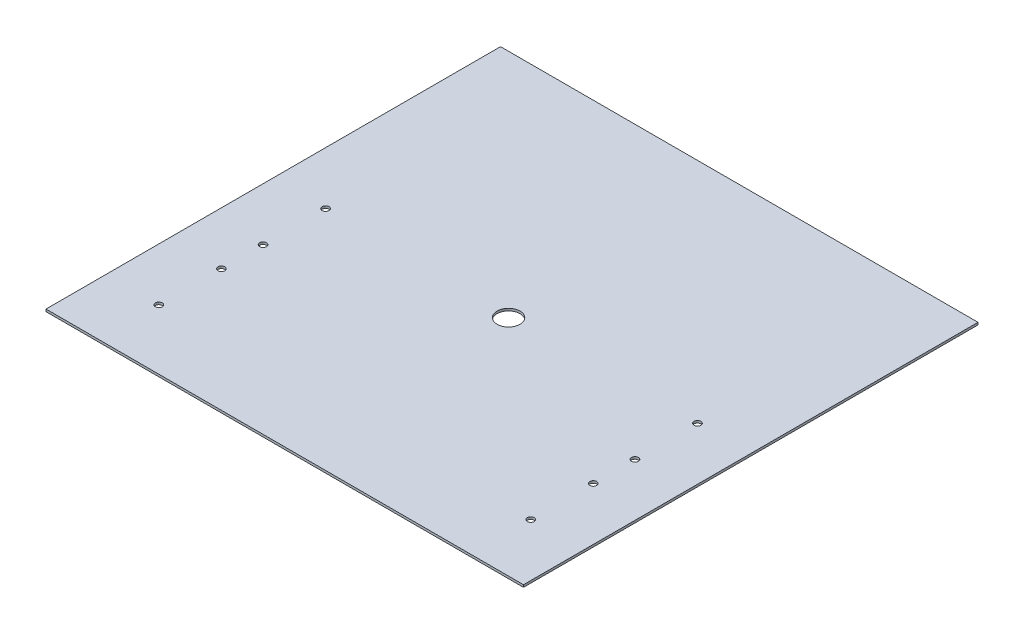
ISO-10303-21;
HEADER;
FILE_DESCRIPTION(('STEP AP214'),'2;1');
FILE_NAME('part.step','',(''),(''),'','','');
FILE_SCHEMA(('AUTOMOTIVE_DESIGN { 1 0 10303 214 1 1 1 1 }'));
ENDSEC;
DATA;
#1=APPLICATION_CONTEXT('core data for automotive mechanical design processes');
#2=APPLICATION_PROTOCOL_DEFINITION('international standard','automotive_design',2000,#1);
#3=PRODUCT_CONTEXT('',#1,'mechanical');
#4=PRODUCT('Part','Part','',(#3));
#5=PRODUCT_RELATED_PRODUCT_CATEGORY('part','',(#4));
#6=PRODUCT_DEFINITION_FORMATION('','',#4);
#7=PRODUCT_DEFINITION_CONTEXT('part definition',#1,'design');
#8=PRODUCT_DEFINITION('design','',#6,#7);
#9=PRODUCT_DEFINITION_SHAPE('','',#8);
#10=(LENGTH_UNIT() NAMED_UNIT(*) SI_UNIT(.MILLI.,.METRE.));
#11=(NAMED_UNIT(*) PLANE_ANGLE_UNIT() SI_UNIT($,.RADIAN.));
#12=(NAMED_UNIT(*) SI_UNIT($,.STERADIAN.) SOLID_ANGLE_UNIT());
#13=UNCERTAINTY_MEASURE_WITH_UNIT(LENGTH_MEASURE(1.E-05),#10,'distance_accuracy_value','');
#14=(GEOMETRIC_REPRESENTATION_CONTEXT(3) GLOBAL_UNCERTAINTY_ASSIGNED_CONTEXT((#13)) GLOBAL_UNIT_ASSIGNED_CONTEXT((#10,
#11,#12)) REPRESENTATION_CONTEXT('',''));
#15=CARTESIAN_POINT('',(0.,0.,0.));
#16=DIRECTION('',(0.,0.,1.));
#17=DIRECTION('',(1.,0.,0.));
#18=AXIS2_PLACEMENT_3D('',#15,#16,#17);
#19=CARTESIAN_POINT('',(0.,1.,0.));
#20=DIRECTION('',(1.,0.,0.));
#21=DIRECTION('',(0.,0.,-1.));
#22=AXIS2_PLACEMENT_3D('',#19,#20,#21);
#23=PLANE('',#22);
#24=DIRECTION('',(0.,0.,1.));
#25=VECTOR('',#24,1.);
#26=CARTESIAN_POINT('',(0.,0.,0.));
#27=LINE('',#26,#25);
#28=CARTESIAN_POINT('',(0.,0.,-198.));
#29=VERTEX_POINT('',#28);
#30=CARTESIAN_POINT('',(0.,0.,0.));
#31=VERTEX_POINT('',#30);
#32=EDGE_CURVE('E100',#29,#31,#27,.T.);
#33=ORIENTED_EDGE('',*,*,#32,.T.);
#34=DIRECTION('',(0.,-1.,0.));
#35=VECTOR('',#34,1.);
#36=CARTESIAN_POINT('',(0.,1.,0.));
#37=LINE('',#36,#35);
#38=CARTESIAN_POINT('',(0.,1.,0.));
#39=VERTEX_POINT('',#38);
#40=EDGE_CURVE('E11',#39,#31,#37,.T.);
#41=ORIENTED_EDGE('',*,*,#40,.F.);
#42=DIRECTION('',(0.,0.,1.));
#43=VECTOR('',#42,1.);
#44=CARTESIAN_POINT('',(0.,1.,0.));
#45=LINE('',#44,#43);
#46=CARTESIAN_POINT('',(0.,1.,-198.));
#47=VERTEX_POINT('',#46);
#48=EDGE_CURVE('E87',#47,#39,#45,.T.);
#49=ORIENTED_EDGE('',*,*,#48,.F.);
#50=DIRECTION('',(0.,-1.,0.));
#51=VECTOR('',#50,1.);
#52=CARTESIAN_POINT('',(0.,1.,-198.));
#53=LINE('',#52,#51);
#54=EDGE_CURVE('E96',#47,#29,#53,.T.);
#55=ORIENTED_EDGE('',*,*,#54,.T.);
#56=EDGE_LOOP('',(#33,#41,#49,#55));
#57=FACE_BOUND('',#56,.T.);
#58=ADVANCED_FACE('F35',(#57),#23,.F.);
#59=CARTESIAN_POINT('',(0.,1.,0.));
#60=DIRECTION('',(0.,0.,-1.));
#61=DIRECTION('',(-1.,0.,0.));
#62=AXIS2_PLACEMENT_3D('',#59,#60,#61);
#63=PLANE('',#62);
#64=DIRECTION('',(1.,0.,0.));
#65=VECTOR('',#64,1.);
#66=CARTESIAN_POINT('',(0.,0.,0.));
#67=LINE('',#66,#65);
#68=CARTESIAN_POINT('',(208.,0.,0.));
#69=VERTEX_POINT('',#68);
#70=EDGE_CURVE('E91',#31,#69,#67,.T.);
#71=ORIENTED_EDGE('',*,*,#70,.T.);
#72=DIRECTION('',(0.,-1.,0.));
#73=VECTOR('',#72,1.);
#74=CARTESIAN_POINT('',(208.,1.,0.));
#75=LINE('',#74,#73);
#76=CARTESIAN_POINT('',(208.,1.,0.));
#77=VERTEX_POINT('',#76);
#78=EDGE_CURVE('E44',#77,#69,#75,.T.);
#79=ORIENTED_EDGE('',*,*,#78,.F.);
#80=DIRECTION('',(1.,0.,0.));
#81=VECTOR('',#80,1.);
#82=CARTESIAN_POINT('',(0.,1.,0.));
#83=LINE('',#82,#81);
#84=EDGE_CURVE('E82',#39,#77,#83,.T.);
#85=ORIENTED_EDGE('',*,*,#84,.F.);
#86=ORIENTED_EDGE('',*,*,#40,.T.);
#87=EDGE_LOOP('',(#71,#79,#85,#86));
#88=FACE_BOUND('',#87,.T.);
#89=ADVANCED_FACE('F90',(#88),#63,.F.);
#90=CARTESIAN_POINT('',(208.,1.,0.));
#91=DIRECTION('',(-1.,0.,0.));
#92=DIRECTION('',(0.,0.,1.));
#93=AXIS2_PLACEMENT_3D('',#90,#91,#92);
#94=PLANE('',#93);
#95=DIRECTION('',(0.,0.,-1.));
#96=VECTOR('',#95,1.);
#97=CARTESIAN_POINT('',(208.,0.,0.));
#98=LINE('',#97,#96);
#99=CARTESIAN_POINT('',(208.,0.,-198.));
#100=VERTEX_POINT('',#99);
#101=EDGE_CURVE('E69',#69,#100,#98,.T.);
#102=ORIENTED_EDGE('',*,*,#101,.T.);
#103=DIRECTION('',(0.,-1.,0.));
#104=VECTOR('',#103,1.);
#105=CARTESIAN_POINT('',(208.,1.,-198.));
#106=LINE('',#105,#104);
#107=CARTESIAN_POINT('',(208.,1.,-198.));
#108=VERTEX_POINT('',#107);
#109=EDGE_CURVE('E92',#108,#100,#106,.T.);
#110=ORIENTED_EDGE('',*,*,#109,.F.);
#111=DIRECTION('',(0.,0.,-1.));
#112=VECTOR('',#111,1.);
#113=CARTESIAN_POINT('',(208.,1.,0.));
#114=LINE('',#113,#112);
#115=EDGE_CURVE('E85',#77,#108,#114,.T.);
#116=ORIENTED_EDGE('',*,*,#115,.F.);
#117=ORIENTED_EDGE('',*,*,#78,.T.);
#118=EDGE_LOOP('',(#102,#110,#116,#117));
#119=FACE_BOUND('',#118,.T.);
#120=ADVANCED_FACE('F94',(#119),#94,.F.);
#121=CARTESIAN_POINT('',(0.,1.,-198.));
#122=DIRECTION('',(0.,0.,1.));
#123=DIRECTION('',(1.,0.,0.));
#124=AXIS2_PLACEMENT_3D('',#121,#122,#123);
#125=PLANE('',#124);
#126=DIRECTION('',(-1.,0.,0.));
#127=VECTOR('',#126,1.);
#128=CARTESIAN_POINT('',(0.,0.,-198.));
#129=LINE('',#128,#127);
#130=EDGE_CURVE('E75',#100,#29,#129,.T.);
#131=ORIENTED_EDGE('',*,*,#130,.T.);
#132=ORIENTED_EDGE('',*,*,#54,.F.);
#133=DIRECTION('',(-1.,0.,0.));
#134=VECTOR('',#133,1.);
#135=CARTESIAN_POINT('',(0.,1.,-198.));
#136=LINE('',#135,#134);
#137=EDGE_CURVE('E52',#108,#47,#136,.T.);
#138=ORIENTED_EDGE('',*,*,#137,.F.);
#139=ORIENTED_EDGE('',*,*,#109,.T.);
#140=EDGE_LOOP('',(#131,#132,#138,#139));
#141=FACE_BOUND('',#140,.T.);
#142=ADVANCED_FACE('F107',(#141),#125,.F.);
#143=CARTESIAN_POINT('',(0.,1.,0.));
#144=DIRECTION('',(0.,-1.,0.));
#145=DIRECTION('',(0.,0.,-1.));
#146=AXIS2_PLACEMENT_3D('',#143,#144,#145);
#147=PLANE('',#146);
#148=CARTESIAN_POINT('',(185.,1.,-71.5577619712243));
#149=DIRECTION('',(0.,-1.,0.));
#150=DIRECTION('',(0.,0.,-1.));
#151=AXIS2_PLACEMENT_3D('',#148,#149,#150);
#152=CIRCLE('',#151,1.5);
#153=CARTESIAN_POINT('',(185.,1.,-73.0577619712243));
#154=VERTEX_POINT('',#153);
#155=EDGE_CURVE('E120',#154,#154,#152,.T.);
#156=ORIENTED_EDGE('',*,*,#155,.T.);
#157=EDGE_LOOP('',(#156));
#158=FACE_BOUND('',#157,.T.);
#159=CARTESIAN_POINT('',(185.,1.,-53.4000000000001));
#160=DIRECTION('',(0.,-1.,0.));
#161=DIRECTION('',(0.,0.,-1.));
#162=AXIS2_PLACEMENT_3D('',#159,#160,#161);
#163=CIRCLE('',#162,1.5);
#164=CARTESIAN_POINT('',(185.,1.,-54.9000000000001));
#165=VERTEX_POINT('',#164);
#166=EDGE_CURVE('E139',#165,#165,#163,.T.);
#167=ORIENTED_EDGE('',*,*,#166,.T.);
#168=EDGE_LOOP('',(#167));
#169=FACE_BOUND('',#168,.T.);
#170=CARTESIAN_POINT('',(185.,1.,-26.1600000000001));
#171=DIRECTION('',(0.,-1.,0.));
#172=DIRECTION('',(0.,0.,-1.));
#173=AXIS2_PLACEMENT_3D('',#170,#171,#172);
#174=CIRCLE('',#173,1.5);
#175=CARTESIAN_POINT('',(185.,1.,-27.6600000000001));
#176=VERTEX_POINT('',#175);
#177=EDGE_CURVE('E133',#176,#176,#174,.T.);
#178=ORIENTED_EDGE('',*,*,#177,.T.);
#179=EDGE_LOOP('',(#178));
#180=FACE_BOUND('',#179,.T.);
#181=CARTESIAN_POINT('',(23.0000000000004,1.,-26.1600000000001));
#182=DIRECTION('',(0.,-1.,0.));
#183=DIRECTION('',(0.,0.,1.));
#184=AXIS2_PLACEMENT_3D('',#181,#182,#183);
#185=CIRCLE('',#184,1.5);
#186=CARTESIAN_POINT('',(23.0000000000004,1.,-24.6600000000001));
#187=VERTEX_POINT('',#186);
#188=EDGE_CURVE('E126',#187,#187,#185,.T.);
#189=ORIENTED_EDGE('',*,*,#188,.T.);
#190=EDGE_LOOP('',(#189));
#191=FACE_BOUND('',#190,.T.);
#192=CARTESIAN_POINT('',(23.0000000000004,1.,-53.4000000000001));
#193=DIRECTION('',(0.,-1.,0.));
#194=DIRECTION('',(0.,0.,1.));
#195=AXIS2_PLACEMENT_3D('',#192,#193,#194);
#196=CIRCLE('',#195,1.5);
#197=CARTESIAN_POINT('',(23.0000000000004,1.,-51.9000000000001));
#198=VERTEX_POINT('',#197);
#199=EDGE_CURVE('E127',#198,#198,#196,.T.);
#200=ORIENTED_EDGE('',*,*,#199,.T.);
#201=EDGE_LOOP('',(#200));
#202=FACE_BOUND('',#201,.T.);
#203=CARTESIAN_POINT('',(23.0000000000004,1.,-71.5577619712244));
#204=DIRECTION('',(0.,-1.,0.));
#205=DIRECTION('',(0.,0.,1.));
#206=AXIS2_PLACEMENT_3D('',#203,#204,#205);
#207=CIRCLE('',#206,1.5);
#208=CARTESIAN_POINT('',(23.0000000000004,1.,-70.0577619712244));
#209=VERTEX_POINT('',#208);
#210=EDGE_CURVE('E156',#209,#209,#207,.T.);
#211=ORIENTED_EDGE('',*,*,#210,.T.);
#212=EDGE_LOOP('',(#211));
#213=FACE_BOUND('',#212,.T.);
#214=CARTESIAN_POINT('',(23.0000000000005,1.,-98.7977619712244));
#215=DIRECTION('',(0.,-1.,0.));
#216=DIRECTION('',(0.,0.,1.));
#217=AXIS2_PLACEMENT_3D('',#214,#215,#216);
#218=CIRCLE('',#217,1.5);
#219=CARTESIAN_POINT('',(23.0000000000005,1.,-97.2977619712244));
#220=VERTEX_POINT('',#219);
#221=EDGE_CURVE('E150',#220,#220,#218,.T.);
#222=ORIENTED_EDGE('',*,*,#221,.T.);
#223=EDGE_LOOP('',(#222));
#224=FACE_BOUND('',#223,.T.);
#225=CARTESIAN_POINT('',(185.,1.,-98.7977619712243));
#226=DIRECTION('',(0.,-1.,0.));
#227=DIRECTION('',(0.,0.,-1.));
#228=AXIS2_PLACEMENT_3D('',#225,#226,#227);
#229=CIRCLE('',#228,1.5);
#230=CARTESIAN_POINT('',(185.,1.,-100.297761971224));
#231=VERTEX_POINT('',#230);
#232=EDGE_CURVE('E116',#231,#231,#229,.T.);
#233=ORIENTED_EDGE('',*,*,#232,.T.);
#234=EDGE_LOOP('',(#233));
#235=FACE_BOUND('',#234,.T.);
#236=CARTESIAN_POINT('',(104.,1.,-97.5));
#237=DIRECTION('',(0.,1.,0.));
#238=DIRECTION('',(0.,0.,1.));
#239=AXIS2_PLACEMENT_3D('',#236,#237,#238);
#240=CIRCLE('',#239,5.00000000000001);
#241=CARTESIAN_POINT('',(104.,1.,-92.5));
#242=VERTEX_POINT('',#241);
#243=EDGE_CURVE('E113',#242,#242,#240,.T.);
#244=ORIENTED_EDGE('',*,*,#243,.F.);
#245=EDGE_LOOP('',(#244));
#246=FACE_BOUND('',#245,.T.);
#247=ORIENTED_EDGE('',*,*,#48,.T.);
#248=ORIENTED_EDGE('',*,*,#84,.T.);
#249=ORIENTED_EDGE('',*,*,#115,.T.);
#250=ORIENTED_EDGE('',*,*,#137,.T.);
#251=EDGE_LOOP('',(#247,#248,#249,#250));
#252=FACE_BOUND('',#251,.T.);
#253=ADVANCED_FACE('F83',(#158,#169,#180,#191,#202,#213,#224,#235,#246,#252),#147,.F.);
#254=CARTESIAN_POINT('',(0.,0.,0.));
#255=DIRECTION('',(0.,-1.,0.));
#256=DIRECTION('',(0.,0.,-1.));
#257=AXIS2_PLACEMENT_3D('',#254,#255,#256);
#258=PLANE('',#257);
#259=CARTESIAN_POINT('',(185.,0.,-71.5577619712243));
#260=DIRECTION('',(0.,-1.,0.));
#261=DIRECTION('',(0.,0.,-1.));
#262=AXIS2_PLACEMENT_3D('',#259,#260,#261);
#263=CIRCLE('',#262,1.5);
#264=CARTESIAN_POINT('',(185.,0.,-73.0577619712243));
#265=VERTEX_POINT('',#264);
#266=EDGE_CURVE('E142',#265,#265,#263,.T.);
#267=ORIENTED_EDGE('',*,*,#266,.F.);
#268=EDGE_LOOP('',(#267));
#269=FACE_BOUND('',#268,.T.);
#270=CARTESIAN_POINT('',(185.,0.,-53.4000000000001));
#271=DIRECTION('',(0.,-1.,0.));
#272=DIRECTION('',(0.,0.,-1.));
#273=AXIS2_PLACEMENT_3D('',#270,#271,#272);
#274=CIRCLE('',#273,1.5);
#275=CARTESIAN_POINT('',(185.,0.,-54.9000000000001));
#276=VERTEX_POINT('',#275);
#277=EDGE_CURVE('E136',#276,#276,#274,.T.);
#278=ORIENTED_EDGE('',*,*,#277,.F.);
#279=EDGE_LOOP('',(#278));
#280=FACE_BOUND('',#279,.T.);
#281=CARTESIAN_POINT('',(185.,0.,-26.1600000000001));
#282=DIRECTION('',(0.,-1.,0.));
#283=DIRECTION('',(0.,0.,-1.));
#284=AXIS2_PLACEMENT_3D('',#281,#282,#283);
#285=CIRCLE('',#284,1.5);
#286=CARTESIAN_POINT('',(185.,0.,-27.6600000000001));
#287=VERTEX_POINT('',#286);
#288=EDGE_CURVE('E130',#287,#287,#285,.T.);
#289=ORIENTED_EDGE('',*,*,#288,.F.);
#290=EDGE_LOOP('',(#289));
#291=FACE_BOUND('',#290,.T.);
#292=CARTESIAN_POINT('',(23.0000000000004,0.,-26.1600000000001));
#293=DIRECTION('',(0.,-1.,0.));
#294=DIRECTION('',(0.,0.,1.));
#295=AXIS2_PLACEMENT_3D('',#292,#293,#294);
#296=CIRCLE('',#295,1.5);
#297=CARTESIAN_POINT('',(23.0000000000004,0.,-24.6600000000001));
#298=VERTEX_POINT('',#297);
#299=EDGE_CURVE('E123',#298,#298,#296,.T.);
#300=ORIENTED_EDGE('',*,*,#299,.F.);
#301=EDGE_LOOP('',(#300));
#302=FACE_BOUND('',#301,.T.);
#303=CARTESIAN_POINT('',(23.0000000000004,0.,-53.4000000000001));
#304=DIRECTION('',(0.,-1.,0.));
#305=DIRECTION('',(0.,0.,1.));
#306=AXIS2_PLACEMENT_3D('',#303,#304,#305);
#307=CIRCLE('',#306,1.5);
#308=CARTESIAN_POINT('',(23.0000000000004,0.,-51.9000000000001));
#309=VERTEX_POINT('',#308);
#310=EDGE_CURVE('E159',#309,#309,#307,.T.);
#311=ORIENTED_EDGE('',*,*,#310,.F.);
#312=EDGE_LOOP('',(#311));
#313=FACE_BOUND('',#312,.T.);
#314=CARTESIAN_POINT('',(23.0000000000004,0.,-71.5577619712244));
#315=DIRECTION('',(0.,-1.,0.));
#316=DIRECTION('',(0.,0.,1.));
#317=AXIS2_PLACEMENT_3D('',#314,#315,#316);
#318=CIRCLE('',#317,1.5);
#319=CARTESIAN_POINT('',(23.0000000000004,0.,-70.0577619712244));
#320=VERTEX_POINT('',#319);
#321=EDGE_CURVE('E153',#320,#320,#318,.T.);
#322=ORIENTED_EDGE('',*,*,#321,.F.);
#323=EDGE_LOOP('',(#322));
#324=FACE_BOUND('',#323,.T.);
#325=CARTESIAN_POINT('',(23.0000000000005,0.,-98.7977619712244));
#326=DIRECTION('',(0.,-1.,0.));
#327=DIRECTION('',(0.,0.,1.));
#328=AXIS2_PLACEMENT_3D('',#325,#326,#327);
#329=CIRCLE('',#328,1.5);
#330=CARTESIAN_POINT('',(23.0000000000005,0.,-97.2977619712244));
#331=VERTEX_POINT('',#330);
#332=EDGE_CURVE('E147',#331,#331,#329,.T.);
#333=ORIENTED_EDGE('',*,*,#332,.F.);
#334=EDGE_LOOP('',(#333));
#335=FACE_BOUND('',#334,.T.);
#336=CARTESIAN_POINT('',(185.,0.,-98.7977619712243));
#337=DIRECTION('',(0.,-1.,0.));
#338=DIRECTION('',(0.,0.,-1.));
#339=AXIS2_PLACEMENT_3D('',#336,#337,#338);
#340=CIRCLE('',#339,1.5);
#341=CARTESIAN_POINT('',(185.,0.,-100.297761971224));
#342=VERTEX_POINT('',#341);
#343=EDGE_CURVE('E117',#342,#342,#340,.T.);
#344=ORIENTED_EDGE('',*,*,#343,.F.);
#345=EDGE_LOOP('',(#344));
#346=FACE_BOUND('',#345,.T.);
#347=CARTESIAN_POINT('',(104.,0.,-97.5));
#348=DIRECTION('',(0.,-1.,0.));
#349=DIRECTION('',(0.,0.,-1.));
#350=AXIS2_PLACEMENT_3D('',#347,#348,#349);
#351=CIRCLE('',#350,5.00000000000001);
#352=CARTESIAN_POINT('',(104.,0.,-102.5));
#353=VERTEX_POINT('',#352);
#354=EDGE_CURVE('E38',#353,#353,#351,.T.);
#355=ORIENTED_EDGE('',*,*,#354,.F.);
#356=EDGE_LOOP('',(#355));
#357=FACE_BOUND('',#356,.T.);
#358=ORIENTED_EDGE('',*,*,#32,.F.);
#359=ORIENTED_EDGE('',*,*,#130,.F.);
#360=ORIENTED_EDGE('',*,*,#101,.F.);
#361=ORIENTED_EDGE('',*,*,#70,.F.);
#362=EDGE_LOOP('',(#358,#359,#360,#361));
#363=FACE_BOUND('',#362,.T.);
#364=ADVANCED_FACE('F110',(#269,#280,#291,#302,#313,#324,#335,#346,#357,#363),#258,.T.);
#365=CARTESIAN_POINT('',(104.,-9.,-97.5));
#366=DIRECTION('',(0.,1.,0.));
#367=DIRECTION('',(0.,0.,1.));
#368=AXIS2_PLACEMENT_3D('',#365,#366,#367);
#369=CYLINDRICAL_SURFACE('',#368,5.00000000000001);
#370=ORIENTED_EDGE('',*,*,#354,.T.);
#371=EDGE_LOOP('',(#370));
#372=FACE_BOUND('',#371,.T.);
#373=ORIENTED_EDGE('',*,*,#243,.T.);
#374=EDGE_LOOP('',(#373));
#375=FACE_BOUND('',#374,.T.);
#376=ADVANCED_FACE('F177',(#372,#375),#369,.F.);
#377=CARTESIAN_POINT('',(185.,1.,-98.7977619712243));
#378=DIRECTION('',(0.,-1.,0.));
#379=DIRECTION('',(0.,0.,-1.));
#380=AXIS2_PLACEMENT_3D('',#377,#378,#379);
#381=CYLINDRICAL_SURFACE('',#380,1.5);
#382=ORIENTED_EDGE('',*,*,#232,.F.);
#383=EDGE_LOOP('',(#382));
#384=FACE_BOUND('',#383,.T.);
#385=ORIENTED_EDGE('',*,*,#343,.T.);
#386=EDGE_LOOP('',(#385));
#387=FACE_BOUND('',#386,.T.);
#388=ADVANCED_FACE('F191',(#384,#387),#381,.F.);
#389=CARTESIAN_POINT('',(23.0000000000005,1.,-98.7977619712244));
#390=DIRECTION('',(0.,-1.,0.));
#391=DIRECTION('',(0.,0.,-1.));
#392=AXIS2_PLACEMENT_3D('',#389,#390,#391);
#393=CYLINDRICAL_SURFACE('',#392,1.5);
#394=ORIENTED_EDGE('',*,*,#221,.F.);
#395=EDGE_LOOP('',(#394));
#396=FACE_BOUND('',#395,.T.);
#397=ORIENTED_EDGE('',*,*,#332,.T.);
#398=EDGE_LOOP('',(#397));
#399=FACE_BOUND('',#398,.T.);
#400=ADVANCED_FACE('F242',(#396,#399),#393,.F.);
#401=CARTESIAN_POINT('',(23.0000000000004,1.,-71.5577619712244));
#402=DIRECTION('',(0.,-1.,0.));
#403=DIRECTION('',(0.,0.,-1.));
#404=AXIS2_PLACEMENT_3D('',#401,#402,#403);
#405=CYLINDRICAL_SURFACE('',#404,1.5);
#406=ORIENTED_EDGE('',*,*,#210,.F.);
#407=EDGE_LOOP('',(#406));
#408=FACE_BOUND('',#407,.T.);
#409=ORIENTED_EDGE('',*,*,#321,.T.);
#410=EDGE_LOOP('',(#409));
#411=FACE_BOUND('',#410,.T.);
#412=ADVANCED_FACE('F171',(#408,#411),#405,.F.);
#413=CARTESIAN_POINT('',(23.0000000000004,1.,-53.4000000000001));
#414=DIRECTION('',(0.,-1.,0.));
#415=DIRECTION('',(0.,0.,-1.));
#416=AXIS2_PLACEMENT_3D('',#413,#414,#415);
#417=CYLINDRICAL_SURFACE('',#416,1.5);
#418=ORIENTED_EDGE('',*,*,#199,.F.);
#419=EDGE_LOOP('',(#418));
#420=FACE_BOUND('',#419,.T.);
#421=ORIENTED_EDGE('',*,*,#310,.T.);
#422=EDGE_LOOP('',(#421));
#423=FACE_BOUND('',#422,.T.);
#424=ADVANCED_FACE('F167',(#420,#423),#417,.F.);
#425=CARTESIAN_POINT('',(23.0000000000004,1.,-26.1600000000001));
#426=DIRECTION('',(0.,-1.,0.));
#427=DIRECTION('',(0.,0.,-1.));
#428=AXIS2_PLACEMENT_3D('',#425,#426,#427);
#429=CYLINDRICAL_SURFACE('',#428,1.5);
#430=ORIENTED_EDGE('',*,*,#188,.F.);
#431=EDGE_LOOP('',(#430));
#432=FACE_BOUND('',#431,.T.);
#433=ORIENTED_EDGE('',*,*,#299,.T.);
#434=EDGE_LOOP('',(#433));
#435=FACE_BOUND('',#434,.T.);
#436=ADVANCED_FACE('F170',(#432,#435),#429,.F.);
#437=CARTESIAN_POINT('',(185.,1.,-26.1600000000001));
#438=DIRECTION('',(0.,-1.,0.));
#439=DIRECTION('',(0.,0.,-1.));
#440=AXIS2_PLACEMENT_3D('',#437,#438,#439);
#441=CYLINDRICAL_SURFACE('',#440,1.5);
#442=ORIENTED_EDGE('',*,*,#177,.F.);
#443=EDGE_LOOP('',(#442));
#444=FACE_BOUND('',#443,.T.);
#445=ORIENTED_EDGE('',*,*,#288,.T.);
#446=EDGE_LOOP('',(#445));
#447=FACE_BOUND('',#446,.T.);
#448=ADVANCED_FACE('F276',(#444,#447),#441,.F.);
#449=CARTESIAN_POINT('',(185.,1.,-53.4000000000001));
#450=DIRECTION('',(0.,-1.,0.));
#451=DIRECTION('',(0.,0.,-1.));
#452=AXIS2_PLACEMENT_3D('',#449,#450,#451);
#453=CYLINDRICAL_SURFACE('',#452,1.5);
#454=ORIENTED_EDGE('',*,*,#166,.F.);
#455=EDGE_LOOP('',(#454));
#456=FACE_BOUND('',#455,.T.);
#457=ORIENTED_EDGE('',*,*,#277,.T.);
#458=EDGE_LOOP('',(#457));
#459=FACE_BOUND('',#458,.T.);
#460=ADVANCED_FACE('F286',(#456,#459),#453,.F.);
#461=CARTESIAN_POINT('',(185.,1.,-71.5577619712243));
#462=DIRECTION('',(0.,-1.,0.));
#463=DIRECTION('',(0.,0.,-1.));
#464=AXIS2_PLACEMENT_3D('',#461,#462,#463);
#465=CYLINDRICAL_SURFACE('',#464,1.5);
#466=ORIENTED_EDGE('',*,*,#155,.F.);
#467=EDGE_LOOP('',(#466));
#468=FACE_BOUND('',#467,.T.);
#469=ORIENTED_EDGE('',*,*,#266,.T.);
#470=EDGE_LOOP('',(#469));
#471=FACE_BOUND('',#470,.T.);
#472=ADVANCED_FACE('F296',(#468,#471),#465,.F.);
#473=CLOSED_SHELL('',(#58,#89,#120,#142,#253,#364,#376,#388,#400,#412,#424,#436,#448,#460,#472));
#474=MANIFOLD_SOLID_BREP('B2',#473);
#475=ADVANCED_BREP_SHAPE_REPRESENTATION('',(#18,#474),#14);
#476=SHAPE_DEFINITION_REPRESENTATION(#9,#475);
ENDSEC;
END-ISO-10303-21;
